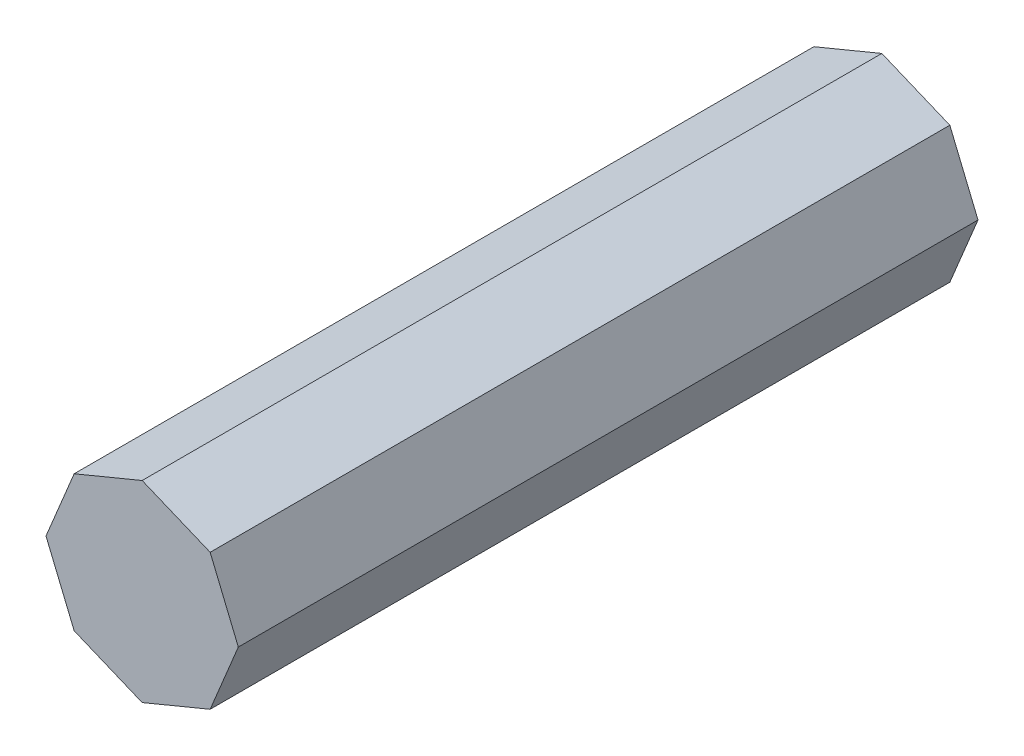
ISO-10303-21;
HEADER;
FILE_DESCRIPTION(('STEP AP214'),'2;1');
FILE_NAME('part.step','',(''),(''),'','','');
FILE_SCHEMA(('AUTOMOTIVE_DESIGN { 1 0 10303 214 1 1 1 1 }'));
ENDSEC;
DATA;
#1=APPLICATION_CONTEXT('core data for automotive mechanical design processes');
#2=APPLICATION_PROTOCOL_DEFINITION('international standard','automotive_design',2000,#1);
#3=PRODUCT_CONTEXT('',#1,'mechanical');
#4=PRODUCT('Part','Part','',(#3));
#5=PRODUCT_RELATED_PRODUCT_CATEGORY('part','',(#4));
#6=PRODUCT_DEFINITION_FORMATION('','',#4);
#7=PRODUCT_DEFINITION_CONTEXT('part definition',#1,'design');
#8=PRODUCT_DEFINITION('design','',#6,#7);
#9=PRODUCT_DEFINITION_SHAPE('','',#8);
#10=(LENGTH_UNIT() NAMED_UNIT(*) SI_UNIT(.MILLI.,.METRE.));
#11=(NAMED_UNIT(*) PLANE_ANGLE_UNIT() SI_UNIT($,.RADIAN.));
#12=(NAMED_UNIT(*) SI_UNIT($,.STERADIAN.) SOLID_ANGLE_UNIT());
#13=UNCERTAINTY_MEASURE_WITH_UNIT(LENGTH_MEASURE(1.E-05),#10,'distance_accuracy_value','');
#14=(GEOMETRIC_REPRESENTATION_CONTEXT(3) GLOBAL_UNCERTAINTY_ASSIGNED_CONTEXT((#13)) GLOBAL_UNIT_ASSIGNED_CONTEXT((#10,
#11,#12)) REPRESENTATION_CONTEXT('',''));
#15=CARTESIAN_POINT('',(0.,0.,0.));
#16=DIRECTION('',(0.,0.,1.));
#17=DIRECTION('',(1.,0.,0.));
#18=AXIS2_PLACEMENT_3D('',#15,#16,#17);
#19=CARTESIAN_POINT('',(0.,0.,60.));
#20=DIRECTION('',(0.,0.,1.));
#21=DIRECTION('',(1.,0.,0.));
#22=AXIS2_PLACEMENT_3D('',#19,#20,#21);
#23=PLANE('',#22);
#24=DIRECTION('',(0.3826834323651,-0.923879532511282,0.));
#25=VECTOR('',#24,1.);
#26=CARTESIAN_POINT('',(-7.8,0.,60.));
#27=LINE('',#26,#25);
#28=CARTESIAN_POINT('',(-7.8,0.,60.));
#29=VERTEX_POINT('',#28);
#30=CARTESIAN_POINT('',(-5.51543289325501,-5.51543289325513,60.));
#31=VERTEX_POINT('',#30);
#32=EDGE_CURVE('E189',#29,#31,#27,.T.);
#33=ORIENTED_EDGE('',*,*,#32,.T.);
#34=DIRECTION('',(0.923879532511291,-0.382683432365079,0.));
#35=VECTOR('',#34,1.);
#36=CARTESIAN_POINT('',(-5.51543289325501,-5.51543289325513,60.));
#37=LINE('',#36,#35);
#38=CARTESIAN_POINT('',(0.,-7.8,60.));
#39=VERTEX_POINT('',#38);
#40=EDGE_CURVE('E194',#31,#39,#37,.T.);
#41=ORIENTED_EDGE('',*,*,#40,.T.);
#42=DIRECTION('',(0.923879532511282,0.3826834323651,0.));
#43=VECTOR('',#42,1.);
#44=CARTESIAN_POINT('',(0.,-7.8,60.));
#45=LINE('',#44,#43);
#46=CARTESIAN_POINT('',(5.51543289325515,-5.515432893255,60.));
#47=VERTEX_POINT('',#46);
#48=EDGE_CURVE('E107',#39,#47,#45,.T.);
#49=ORIENTED_EDGE('',*,*,#48,.T.);
#50=DIRECTION('',(0.382683432365079,0.923879532511291,0.));
#51=VECTOR('',#50,1.);
#52=CARTESIAN_POINT('',(5.51543289325513,-5.51543289325501,60.));
#53=LINE('',#52,#51);
#54=CARTESIAN_POINT('',(7.8,0.,60.));
#55=VERTEX_POINT('',#54);
#56=EDGE_CURVE('E116',#47,#55,#53,.T.);
#57=ORIENTED_EDGE('',*,*,#56,.T.);
#58=DIRECTION('',(-0.382683432365101,0.923879532511282,0.));
#59=VECTOR('',#58,1.);
#60=CARTESIAN_POINT('',(7.8,0.,60.));
#61=LINE('',#60,#59);
#62=CARTESIAN_POINT('',(5.51543289325501,5.51543289325513,60.));
#63=VERTEX_POINT('',#62);
#64=EDGE_CURVE('E120',#55,#63,#61,.T.);
#65=ORIENTED_EDGE('',*,*,#64,.T.);
#66=DIRECTION('',(-0.923879532511291,0.382683432365079,0.));
#67=VECTOR('',#66,1.);
#68=CARTESIAN_POINT('',(5.51543289325501,5.51543289325513,60.));
#69=LINE('',#68,#67);
#70=CARTESIAN_POINT('',(0.,7.8,60.));
#71=VERTEX_POINT('',#70);
#72=EDGE_CURVE('E56',#63,#71,#69,.T.);
#73=ORIENTED_EDGE('',*,*,#72,.T.);
#74=DIRECTION('',(-0.923879532511282,-0.382683432365101,0.));
#75=VECTOR('',#74,1.);
#76=CARTESIAN_POINT('',(0.,7.8,60.));
#77=LINE('',#76,#75);
#78=CARTESIAN_POINT('',(-5.51543289325512,5.51543289325501,60.));
#79=VERTEX_POINT('',#78);
#80=EDGE_CURVE('E181',#71,#79,#77,.T.);
#81=ORIENTED_EDGE('',*,*,#80,.T.);
#82=DIRECTION('',(-0.382683432365079,-0.923879532511291,0.));
#83=VECTOR('',#82,1.);
#84=CARTESIAN_POINT('',(-5.51543289325513,5.51543289325501,60.));
#85=LINE('',#84,#83);
#86=EDGE_CURVE('E177',#79,#29,#85,.T.);
#87=ORIENTED_EDGE('',*,*,#86,.T.);
#88=EDGE_LOOP('',(#33,#41,#49,#57,#65,#73,#81,#87));
#89=FACE_BOUND('',#88,.T.);
#90=ADVANCED_FACE('F39',(#89),#23,.T.);
#91=CARTESIAN_POINT('',(5.51543289325513,-5.51543289325501,60.));
#92=DIRECTION('',(-0.923879532511291,0.382683432365079,0.));
#93=DIRECTION('',(-0.382683432365079,-0.923879532511291,0.));
#94=AXIS2_PLACEMENT_3D('',#91,#92,#93);
#95=PLANE('',#94);
#96=DIRECTION('',(0.382683432365079,0.923879532511291,0.));
#97=VECTOR('',#96,1.);
#98=CARTESIAN_POINT('',(5.51543289325513,-5.51543289325501,0.));
#99=LINE('',#98,#97);
#100=CARTESIAN_POINT('',(5.51543289325513,-5.51543289325501,0.));
#101=VERTEX_POINT('',#100);
#102=CARTESIAN_POINT('',(7.8,0.,0.));
#103=VERTEX_POINT('',#102);
#104=EDGE_CURVE('E114',#101,#103,#99,.T.);
#105=ORIENTED_EDGE('',*,*,#104,.T.);
#106=DIRECTION('',(0.,0.,-1.));
#107=VECTOR('',#106,1.);
#108=CARTESIAN_POINT('',(7.8,0.,60.));
#109=LINE('',#108,#107);
#110=EDGE_CURVE('E11',#55,#103,#109,.T.);
#111=ORIENTED_EDGE('',*,*,#110,.F.);
#112=ORIENTED_EDGE('',*,*,#56,.F.);
#113=DIRECTION('',(0.,0.,-1.));
#114=VECTOR('',#113,1.);
#115=CARTESIAN_POINT('',(5.51543289325513,-5.51543289325501,60.));
#116=LINE('',#115,#114);
#117=EDGE_CURVE('E109',#47,#101,#116,.T.);
#118=ORIENTED_EDGE('',*,*,#117,.T.);
#119=EDGE_LOOP('',(#105,#111,#112,#118));
#120=FACE_BOUND('',#119,.T.);
#121=ADVANCED_FACE('F41',(#120),#95,.F.);
#122=CARTESIAN_POINT('',(7.8,0.,60.));
#123=DIRECTION('',(-0.923879532511282,-0.382683432365101,0.));
#124=DIRECTION('',(0.382683432365101,-0.923879532511282,0.));
#125=AXIS2_PLACEMENT_3D('',#122,#123,#124);
#126=PLANE('',#125);
#127=DIRECTION('',(-0.382683432365101,0.923879532511282,0.));
#128=VECTOR('',#127,1.);
#129=CARTESIAN_POINT('',(7.8,0.,0.));
#130=LINE('',#129,#128);
#131=CARTESIAN_POINT('',(5.51543289325501,5.51543289325513,0.));
#132=VERTEX_POINT('',#131);
#133=EDGE_CURVE('E150',#103,#132,#130,.T.);
#134=ORIENTED_EDGE('',*,*,#133,.T.);
#135=DIRECTION('',(0.,0.,-1.));
#136=VECTOR('',#135,1.);
#137=CARTESIAN_POINT('',(5.51543289325501,5.51543289325513,60.));
#138=LINE('',#137,#136);
#139=EDGE_CURVE('E49',#63,#132,#138,.T.);
#140=ORIENTED_EDGE('',*,*,#139,.F.);
#141=ORIENTED_EDGE('',*,*,#64,.F.);
#142=ORIENTED_EDGE('',*,*,#110,.T.);
#143=EDGE_LOOP('',(#134,#140,#141,#142));
#144=FACE_BOUND('',#143,.T.);
#145=ADVANCED_FACE('F206',(#144),#126,.F.);
#146=CARTESIAN_POINT('',(5.51543289325501,5.51543289325513,60.));
#147=DIRECTION('',(-0.382683432365079,-0.923879532511291,0.));
#148=DIRECTION('',(0.923879532511291,-0.382683432365079,0.));
#149=AXIS2_PLACEMENT_3D('',#146,#147,#148);
#150=PLANE('',#149);
#151=DIRECTION('',(-0.923879532511291,0.382683432365079,0.));
#152=VECTOR('',#151,1.);
#153=CARTESIAN_POINT('',(5.51543289325501,5.51543289325513,0.));
#154=LINE('',#153,#152);
#155=CARTESIAN_POINT('',(0.,7.8,0.));
#156=VERTEX_POINT('',#155);
#157=EDGE_CURVE('E145',#132,#156,#154,.T.);
#158=ORIENTED_EDGE('',*,*,#157,.T.);
#159=DIRECTION('',(0.,0.,-1.));
#160=VECTOR('',#159,1.);
#161=CARTESIAN_POINT('',(0.,7.8,60.));
#162=LINE('',#161,#160);
#163=EDGE_CURVE('E136',#71,#156,#162,.T.);
#164=ORIENTED_EDGE('',*,*,#163,.F.);
#165=ORIENTED_EDGE('',*,*,#72,.F.);
#166=ORIENTED_EDGE('',*,*,#139,.T.);
#167=EDGE_LOOP('',(#158,#164,#165,#166));
#168=FACE_BOUND('',#167,.T.);
#169=ADVANCED_FACE('F144',(#168),#150,.F.);
#170=CARTESIAN_POINT('',(0.,7.8,60.));
#171=DIRECTION('',(0.382683432365101,-0.923879532511282,0.));
#172=DIRECTION('',(0.923879532511282,0.382683432365101,0.));
#173=AXIS2_PLACEMENT_3D('',#170,#171,#172);
#174=PLANE('',#173);
#175=DIRECTION('',(-0.923879532511282,-0.382683432365101,0.));
#176=VECTOR('',#175,1.);
#177=CARTESIAN_POINT('',(0.,7.8,0.));
#178=LINE('',#177,#176);
#179=CARTESIAN_POINT('',(-5.51543289325513,5.51543289325501,0.));
#180=VERTEX_POINT('',#179);
#181=EDGE_CURVE('E152',#156,#180,#178,.T.);
#182=ORIENTED_EDGE('',*,*,#181,.T.);
#183=DIRECTION('',(0.,0.,-1.));
#184=VECTOR('',#183,1.);
#185=CARTESIAN_POINT('',(-5.51543289325513,5.51543289325501,60.));
#186=LINE('',#185,#184);
#187=EDGE_CURVE('E132',#79,#180,#186,.T.);
#188=ORIENTED_EDGE('',*,*,#187,.F.);
#189=ORIENTED_EDGE('',*,*,#80,.F.);
#190=ORIENTED_EDGE('',*,*,#163,.T.);
#191=EDGE_LOOP('',(#182,#188,#189,#190));
#192=FACE_BOUND('',#191,.T.);
#193=ADVANCED_FACE('F180',(#192),#174,.F.);
#194=CARTESIAN_POINT('',(-5.51543289325513,5.51543289325501,60.));
#195=DIRECTION('',(0.923879532511291,-0.382683432365079,0.));
#196=DIRECTION('',(0.382683432365079,0.923879532511291,0.));
#197=AXIS2_PLACEMENT_3D('',#194,#195,#196);
#198=PLANE('',#197);
#199=DIRECTION('',(-0.382683432365079,-0.923879532511291,0.));
#200=VECTOR('',#199,1.);
#201=CARTESIAN_POINT('',(-5.51543289325513,5.51543289325501,0.));
#202=LINE('',#201,#200);
#203=CARTESIAN_POINT('',(-7.8,0.,0.));
#204=VERTEX_POINT('',#203);
#205=EDGE_CURVE('E157',#180,#204,#202,.T.);
#206=ORIENTED_EDGE('',*,*,#205,.T.);
#207=DIRECTION('',(0.,0.,-1.));
#208=VECTOR('',#207,1.);
#209=CARTESIAN_POINT('',(-7.8,0.,60.));
#210=LINE('',#209,#208);
#211=EDGE_CURVE('E128',#29,#204,#210,.T.);
#212=ORIENTED_EDGE('',*,*,#211,.F.);
#213=ORIENTED_EDGE('',*,*,#86,.F.);
#214=ORIENTED_EDGE('',*,*,#187,.T.);
#215=EDGE_LOOP('',(#206,#212,#213,#214));
#216=FACE_BOUND('',#215,.T.);
#217=ADVANCED_FACE('F171',(#216),#198,.F.);
#218=CARTESIAN_POINT('',(-7.8,0.,60.));
#219=DIRECTION('',(0.923879532511282,0.3826834323651,0.));
#220=DIRECTION('',(-0.382683432365101,0.923879532511283,0.));
#221=AXIS2_PLACEMENT_3D('',#218,#219,#220);
#222=PLANE('',#221);
#223=DIRECTION('',(0.3826834323651,-0.923879532511282,0.));
#224=VECTOR('',#223,1.);
#225=CARTESIAN_POINT('',(-7.8,0.,0.));
#226=LINE('',#225,#224);
#227=CARTESIAN_POINT('',(-5.51543289325501,-5.51543289325513,0.));
#228=VERTEX_POINT('',#227);
#229=EDGE_CURVE('E100',#204,#228,#226,.T.);
#230=ORIENTED_EDGE('',*,*,#229,.T.);
#231=DIRECTION('',(0.,0.,-1.));
#232=VECTOR('',#231,1.);
#233=CARTESIAN_POINT('',(-5.51543289325501,-5.51543289325513,60.));
#234=LINE('',#233,#232);
#235=EDGE_CURVE('E94',#31,#228,#234,.T.);
#236=ORIENTED_EDGE('',*,*,#235,.F.);
#237=ORIENTED_EDGE('',*,*,#32,.F.);
#238=ORIENTED_EDGE('',*,*,#211,.T.);
#239=EDGE_LOOP('',(#230,#236,#237,#238));
#240=FACE_BOUND('',#239,.T.);
#241=ADVANCED_FACE('F165',(#240),#222,.F.);
#242=CARTESIAN_POINT('',(-5.51543289325501,-5.51543289325513,60.));
#243=DIRECTION('',(0.382683432365079,0.923879532511291,0.));
#244=DIRECTION('',(-0.923879532511291,0.38268343236508,0.));
#245=AXIS2_PLACEMENT_3D('',#242,#243,#244);
#246=PLANE('',#245);
#247=DIRECTION('',(0.923879532511291,-0.382683432365079,0.));
#248=VECTOR('',#247,1.);
#249=CARTESIAN_POINT('',(-5.51543289325501,-5.51543289325513,0.));
#250=LINE('',#249,#248);
#251=CARTESIAN_POINT('',(0.,-7.8,0.));
#252=VERTEX_POINT('',#251);
#253=EDGE_CURVE('E86',#228,#252,#250,.T.);
#254=ORIENTED_EDGE('',*,*,#253,.T.);
#255=DIRECTION('',(0.,0.,-1.));
#256=VECTOR('',#255,1.);
#257=CARTESIAN_POINT('',(0.,-7.8,60.));
#258=LINE('',#257,#256);
#259=EDGE_CURVE('E91',#39,#252,#258,.T.);
#260=ORIENTED_EDGE('',*,*,#259,.F.);
#261=ORIENTED_EDGE('',*,*,#40,.F.);
#262=ORIENTED_EDGE('',*,*,#235,.T.);
#263=EDGE_LOOP('',(#254,#260,#261,#262));
#264=FACE_BOUND('',#263,.T.);
#265=ADVANCED_FACE('F88',(#264),#246,.F.);
#266=CARTESIAN_POINT('',(0.,-7.8,60.));
#267=DIRECTION('',(-0.3826834323651,0.923879532511282,0.));
#268=DIRECTION('',(-0.923879532511283,-0.3826834323651,0.));
#269=AXIS2_PLACEMENT_3D('',#266,#267,#268);
#270=PLANE('',#269);
#271=DIRECTION('',(0.923879532511282,0.3826834323651,0.));
#272=VECTOR('',#271,1.);
#273=CARTESIAN_POINT('',(0.,-7.8,0.));
#274=LINE('',#273,#272);
#275=EDGE_CURVE('E99',#252,#101,#274,.T.);
#276=ORIENTED_EDGE('',*,*,#275,.T.);
#277=ORIENTED_EDGE('',*,*,#117,.F.);
#278=ORIENTED_EDGE('',*,*,#48,.F.);
#279=ORIENTED_EDGE('',*,*,#259,.T.);
#280=EDGE_LOOP('',(#276,#277,#278,#279));
#281=FACE_BOUND('',#280,.T.);
#282=ADVANCED_FACE('F103',(#281),#270,.F.);
#283=CARTESIAN_POINT('',(0.,0.,0.));
#284=DIRECTION('',(0.,0.,1.));
#285=DIRECTION('',(1.,0.,0.));
#286=AXIS2_PLACEMENT_3D('',#283,#284,#285);
#287=PLANE('',#286);
#288=ORIENTED_EDGE('',*,*,#104,.F.);
#289=ORIENTED_EDGE('',*,*,#275,.F.);
#290=ORIENTED_EDGE('',*,*,#253,.F.);
#291=ORIENTED_EDGE('',*,*,#229,.F.);
#292=ORIENTED_EDGE('',*,*,#205,.F.);
#293=ORIENTED_EDGE('',*,*,#181,.F.);
#294=ORIENTED_EDGE('',*,*,#157,.F.);
#295=ORIENTED_EDGE('',*,*,#133,.F.);
#296=EDGE_LOOP('',(#288,#289,#290,#291,#292,#293,#294,#295));
#297=FACE_BOUND('',#296,.T.);
#298=ADVANCED_FACE('F112',(#297),#287,.F.);
#299=CLOSED_SHELL('',(#90,#121,#145,#169,#193,#217,#241,#265,#282,#298));
#300=MANIFOLD_SOLID_BREP('B2',#299);
#301=ADVANCED_BREP_SHAPE_REPRESENTATION('',(#18,#300),#14);
#302=SHAPE_DEFINITION_REPRESENTATION(#9,#301);
ENDSEC;
END-ISO-10303-21;
